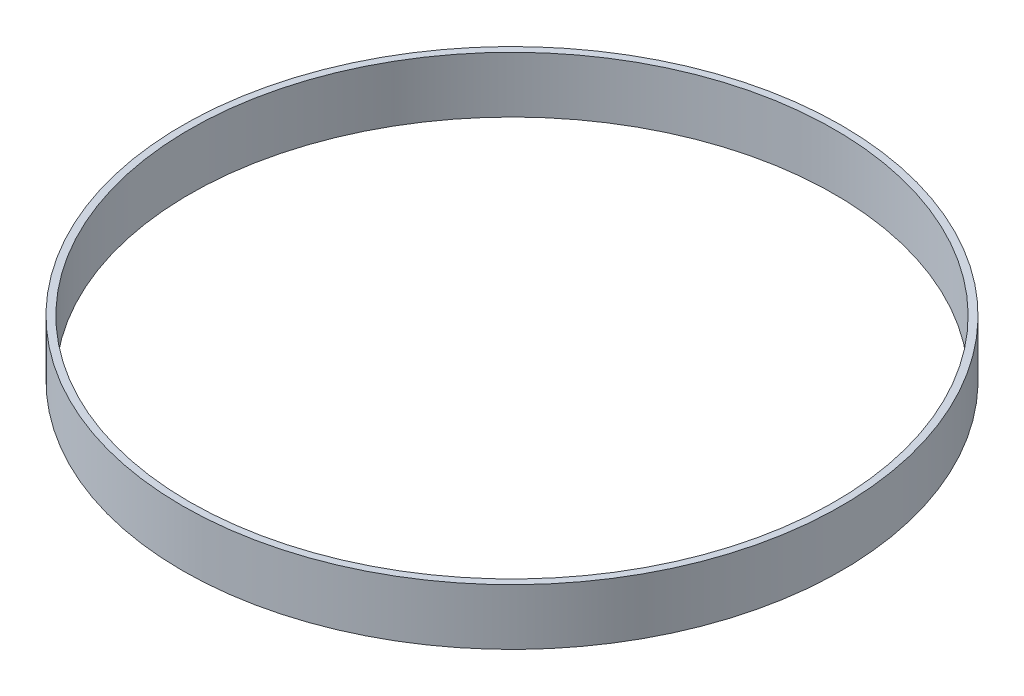
ISO-10303-21;
HEADER;
FILE_DESCRIPTION(('STEP AP214'),'2;1');
FILE_NAME('part.step','',(''),(''),'','','');
FILE_SCHEMA(('AUTOMOTIVE_DESIGN { 1 0 10303 214 1 1 1 1 }'));
ENDSEC;
DATA;
#1=APPLICATION_CONTEXT('core data for automotive mechanical design processes');
#2=APPLICATION_PROTOCOL_DEFINITION('international standard','automotive_design',2000,#1);
#3=PRODUCT_CONTEXT('',#1,'mechanical');
#4=PRODUCT('Part','Part','',(#3));
#5=PRODUCT_RELATED_PRODUCT_CATEGORY('part','',(#4));
#6=PRODUCT_DEFINITION_FORMATION('','',#4);
#7=PRODUCT_DEFINITION_CONTEXT('part definition',#1,'design');
#8=PRODUCT_DEFINITION('design','',#6,#7);
#9=PRODUCT_DEFINITION_SHAPE('','',#8);
#10=(LENGTH_UNIT() NAMED_UNIT(*) SI_UNIT(.MILLI.,.METRE.));
#11=(NAMED_UNIT(*) PLANE_ANGLE_UNIT() SI_UNIT($,.RADIAN.));
#12=(NAMED_UNIT(*) SI_UNIT($,.STERADIAN.) SOLID_ANGLE_UNIT());
#13=UNCERTAINTY_MEASURE_WITH_UNIT(LENGTH_MEASURE(1.E-05),#10,'distance_accuracy_value','');
#14=(GEOMETRIC_REPRESENTATION_CONTEXT(3) GLOBAL_UNCERTAINTY_ASSIGNED_CONTEXT((#13)) GLOBAL_UNIT_ASSIGNED_CONTEXT((#10,
#11,#12)) REPRESENTATION_CONTEXT('',''));
#15=CARTESIAN_POINT('',(0.,0.,0.));
#16=DIRECTION('',(0.,0.,1.));
#17=DIRECTION('',(1.,0.,0.));
#18=AXIS2_PLACEMENT_3D('',#15,#16,#17);
#19=CARTESIAN_POINT('',(0.,8.,0.));
#20=DIRECTION('',(0.,1.,0.));
#21=DIRECTION('',(0.,0.,1.));
#22=AXIS2_PLACEMENT_3D('',#19,#20,#21);
#23=PLANE('',#22);
#24=CARTESIAN_POINT('',(0.,8.,0.));
#25=DIRECTION('',(0.,1.,0.));
#26=DIRECTION('',(0.,0.,1.));
#27=AXIS2_PLACEMENT_3D('',#24,#25,#26);
#28=CIRCLE('',#27,47.);
#29=CARTESIAN_POINT('',(0.,8.,47.));
#30=VERTEX_POINT('',#29);
#31=EDGE_CURVE('E10',#30,#30,#28,.T.);
#32=ORIENTED_EDGE('',*,*,#31,.T.);
#33=EDGE_LOOP('',(#32));
#34=FACE_BOUND('',#33,.T.);
#35=CARTESIAN_POINT('',(0.,8.,0.));
#36=DIRECTION('',(0.,1.,0.));
#37=DIRECTION('',(0.,0.,1.));
#38=AXIS2_PLACEMENT_3D('',#35,#36,#37);
#39=CIRCLE('',#38,46.);
#40=CARTESIAN_POINT('',(0.,8.,46.));
#41=VERTEX_POINT('',#40);
#42=EDGE_CURVE('E41',#41,#41,#39,.T.);
#43=ORIENTED_EDGE('',*,*,#42,.F.);
#44=EDGE_LOOP('',(#43));
#45=FACE_BOUND('',#44,.T.);
#46=ADVANCED_FACE('F30',(#34,#45),#23,.T.);
#47=CARTESIAN_POINT('',(0.,0.,0.));
#48=DIRECTION('',(0.,1.,0.));
#49=DIRECTION('',(0.,0.,1.));
#50=AXIS2_PLACEMENT_3D('',#47,#48,#49);
#51=PLANE('',#50);
#52=CARTESIAN_POINT('',(0.,0.,0.));
#53=DIRECTION('',(0.,1.,0.));
#54=DIRECTION('',(0.,0.,1.));
#55=AXIS2_PLACEMENT_3D('',#52,#53,#54);
#56=CIRCLE('',#55,47.);
#57=CARTESIAN_POINT('',(0.,0.,47.));
#58=VERTEX_POINT('',#57);
#59=EDGE_CURVE('E34',#58,#58,#56,.T.);
#60=ORIENTED_EDGE('',*,*,#59,.F.);
#61=EDGE_LOOP('',(#60));
#62=FACE_BOUND('',#61,.T.);
#63=CARTESIAN_POINT('',(0.,0.,0.));
#64=DIRECTION('',(0.,1.,0.));
#65=DIRECTION('',(0.,0.,1.));
#66=AXIS2_PLACEMENT_3D('',#63,#64,#65);
#67=CIRCLE('',#66,46.);
#68=CARTESIAN_POINT('',(0.,0.,46.));
#69=VERTEX_POINT('',#68);
#70=EDGE_CURVE('E43',#69,#69,#67,.T.);
#71=ORIENTED_EDGE('',*,*,#70,.T.);
#72=EDGE_LOOP('',(#71));
#73=FACE_BOUND('',#72,.T.);
#74=ADVANCED_FACE('F53',(#62,#73),#51,.F.);
#75=CARTESIAN_POINT('',(0.,8.,0.));
#76=DIRECTION('',(0.,-1.,0.));
#77=DIRECTION('',(0.,0.,-1.));
#78=AXIS2_PLACEMENT_3D('',#75,#76,#77);
#79=CYLINDRICAL_SURFACE('',#78,47.);
#80=ORIENTED_EDGE('',*,*,#31,.F.);
#81=EDGE_LOOP('',(#80));
#82=FACE_BOUND('',#81,.T.);
#83=ORIENTED_EDGE('',*,*,#59,.T.);
#84=EDGE_LOOP('',(#83));
#85=FACE_BOUND('',#84,.T.);
#86=ADVANCED_FACE('F32',(#82,#85),#79,.T.);
#87=CARTESIAN_POINT('',(0.,8.,0.));
#88=DIRECTION('',(0.,-1.,0.));
#89=DIRECTION('',(0.,0.,-1.));
#90=AXIS2_PLACEMENT_3D('',#87,#88,#89);
#91=CYLINDRICAL_SURFACE('',#90,46.);
#92=ORIENTED_EDGE('',*,*,#42,.T.);
#93=EDGE_LOOP('',(#92));
#94=FACE_BOUND('',#93,.T.);
#95=ORIENTED_EDGE('',*,*,#70,.F.);
#96=EDGE_LOOP('',(#95));
#97=FACE_BOUND('',#96,.T.);
#98=ADVANCED_FACE('F49',(#94,#97),#91,.F.);
#99=CLOSED_SHELL('',(#46,#74,#86,#98));
#100=MANIFOLD_SOLID_BREP('B2',#99);
#101=ADVANCED_BREP_SHAPE_REPRESENTATION('',(#18,#100),#14);
#102=SHAPE_DEFINITION_REPRESENTATION(#9,#101);
ENDSEC;
END-ISO-10303-21;
